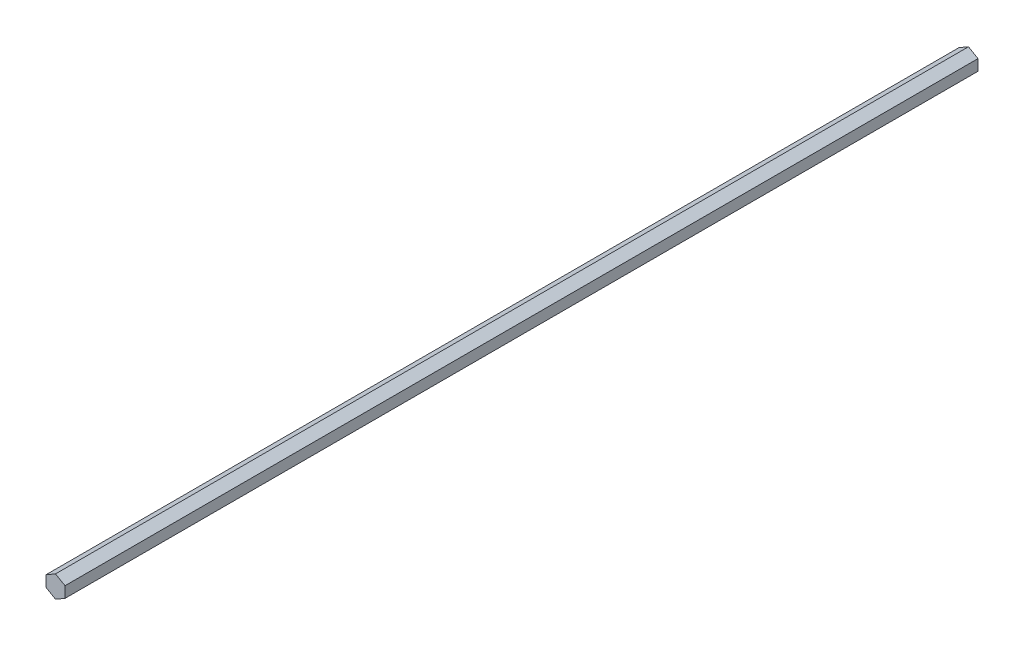
ISO-10303-21;
HEADER;
FILE_DESCRIPTION(('STEP AP214'),'2;1');
FILE_NAME('part.step','',(''),(''),'','','');
FILE_SCHEMA(('AUTOMOTIVE_DESIGN { 1 0 10303 214 1 1 1 1 }'));
ENDSEC;
DATA;
#1=APPLICATION_CONTEXT('core data for automotive mechanical design processes');
#2=APPLICATION_PROTOCOL_DEFINITION('international standard','automotive_design',2000,#1);
#3=PRODUCT_CONTEXT('',#1,'mechanical');
#4=PRODUCT('Part','Part','',(#3));
#5=PRODUCT_RELATED_PRODUCT_CATEGORY('part','',(#4));
#6=PRODUCT_DEFINITION_FORMATION('','',#4);
#7=PRODUCT_DEFINITION_CONTEXT('part definition',#1,'design');
#8=PRODUCT_DEFINITION('design','',#6,#7);
#9=PRODUCT_DEFINITION_SHAPE('','',#8);
#10=(LENGTH_UNIT() NAMED_UNIT(*) SI_UNIT(.MILLI.,.METRE.));
#11=(NAMED_UNIT(*) PLANE_ANGLE_UNIT() SI_UNIT($,.RADIAN.));
#12=(NAMED_UNIT(*) SI_UNIT($,.STERADIAN.) SOLID_ANGLE_UNIT());
#13=UNCERTAINTY_MEASURE_WITH_UNIT(LENGTH_MEASURE(1.E-05),#10,'distance_accuracy_value','');
#14=(GEOMETRIC_REPRESENTATION_CONTEXT(3) GLOBAL_UNCERTAINTY_ASSIGNED_CONTEXT((#13)) GLOBAL_UNIT_ASSIGNED_CONTEXT((#10,
#11,#12)) REPRESENTATION_CONTEXT('',''));
#15=CARTESIAN_POINT('',(0.,0.,0.));
#16=DIRECTION('',(0.,0.,1.));
#17=DIRECTION('',(1.,0.,0.));
#18=AXIS2_PLACEMENT_3D('',#15,#16,#17);
#19=CARTESIAN_POINT('',(-6.35,3.66617420935412,304.8));
#20=DIRECTION('',(0.5,-0.866025403784439,0.));
#21=DIRECTION('',(0.866025403784439,0.5,0.));
#22=AXIS2_PLACEMENT_3D('',#19,#20,#21);
#23=PLANE('',#22);
#24=DIRECTION('',(-0.866025403784439,-0.5,0.));
#25=VECTOR('',#24,1.);
#26=CARTESIAN_POINT('',(-6.35,3.66617420935412,-304.8));
#27=LINE('',#26,#25);
#28=CARTESIAN_POINT('',(0.,7.33234841870825,-304.8));
#29=VERTEX_POINT('',#28);
#30=CARTESIAN_POINT('',(-6.35,3.66617420935412,-304.8));
#31=VERTEX_POINT('',#30);
#32=EDGE_CURVE('E130',#29,#31,#27,.T.);
#33=ORIENTED_EDGE('',*,*,#32,.T.);
#34=DIRECTION('',(0.,0.,-1.));
#35=VECTOR('',#34,1.);
#36=CARTESIAN_POINT('',(-6.35,3.66617420935412,304.8));
#37=LINE('',#36,#35);
#38=CARTESIAN_POINT('',(-6.35,3.66617420935412,304.8));
#39=VERTEX_POINT('',#38);
#40=EDGE_CURVE('E11',#39,#31,#37,.T.);
#41=ORIENTED_EDGE('',*,*,#40,.F.);
#42=DIRECTION('',(-0.866025403784439,-0.5,0.));
#43=VECTOR('',#42,1.);
#44=CARTESIAN_POINT('',(-6.35,3.66617420935412,304.8));
#45=LINE('',#44,#43);
#46=CARTESIAN_POINT('',(0.,7.33234841870825,304.8));
#47=VERTEX_POINT('',#46);
#48=EDGE_CURVE('E146',#47,#39,#45,.T.);
#49=ORIENTED_EDGE('',*,*,#48,.F.);
#50=DIRECTION('',(0.,0.,-1.));
#51=VECTOR('',#50,1.);
#52=CARTESIAN_POINT('',(0.,7.33234841870825,304.8));
#53=LINE('',#52,#51);
#54=EDGE_CURVE('E126',#47,#29,#53,.T.);
#55=ORIENTED_EDGE('',*,*,#54,.T.);
#56=EDGE_LOOP('',(#33,#41,#49,#55));
#57=FACE_BOUND('',#56,.T.);
#58=ADVANCED_FACE('F41',(#57),#23,.F.);
#59=CARTESIAN_POINT('',(-6.35,-3.66617420935412,304.8));
#60=DIRECTION('',(1.,0.,0.));
#61=DIRECTION('',(0.,1.,0.));
#62=AXIS2_PLACEMENT_3D('',#59,#60,#61);
#63=PLANE('',#62);
#64=DIRECTION('',(0.,-1.,0.));
#65=VECTOR('',#64,1.);
#66=CARTESIAN_POINT('',(-6.35,-3.66617420935412,-304.8));
#67=LINE('',#66,#65);
#68=CARTESIAN_POINT('',(-6.35,-3.66617420935412,-304.8));
#69=VERTEX_POINT('',#68);
#70=EDGE_CURVE('E134',#31,#69,#67,.T.);
#71=ORIENTED_EDGE('',*,*,#70,.T.);
#72=DIRECTION('',(0.,0.,-1.));
#73=VECTOR('',#72,1.);
#74=CARTESIAN_POINT('',(-6.35,-3.66617420935412,304.8));
#75=LINE('',#74,#73);
#76=CARTESIAN_POINT('',(-6.35,-3.66617420935412,304.8));
#77=VERTEX_POINT('',#76);
#78=EDGE_CURVE('E50',#77,#69,#75,.T.);
#79=ORIENTED_EDGE('',*,*,#78,.F.);
#80=DIRECTION('',(0.,-1.,0.));
#81=VECTOR('',#80,1.);
#82=CARTESIAN_POINT('',(-6.35,-3.66617420935412,304.8));
#83=LINE('',#82,#81);
#84=EDGE_CURVE('E95',#39,#77,#83,.T.);
#85=ORIENTED_EDGE('',*,*,#84,.F.);
#86=ORIENTED_EDGE('',*,*,#40,.T.);
#87=EDGE_LOOP('',(#71,#79,#85,#86));
#88=FACE_BOUND('',#87,.T.);
#89=ADVANCED_FACE('F174',(#88),#63,.F.);
#90=CARTESIAN_POINT('',(0.,-7.33234841870825,304.8));
#91=DIRECTION('',(0.5,0.866025403784438,0.));
#92=DIRECTION('',(-0.866025403784438,0.5,0.));
#93=AXIS2_PLACEMENT_3D('',#90,#91,#92);
#94=PLANE('',#93);
#95=DIRECTION('',(0.866025403784438,-0.5,0.));
#96=VECTOR('',#95,1.);
#97=CARTESIAN_POINT('',(0.,-7.33234841870825,-304.8));
#98=LINE('',#97,#96);
#99=CARTESIAN_POINT('',(0.,-7.33234841870825,-304.8));
#100=VERTEX_POINT('',#99);
#101=EDGE_CURVE('E137',#69,#100,#98,.T.);
#102=ORIENTED_EDGE('',*,*,#101,.T.);
#103=DIRECTION('',(0.,0.,-1.));
#104=VECTOR('',#103,1.);
#105=CARTESIAN_POINT('',(0.,-7.33234841870825,304.8));
#106=LINE('',#105,#104);
#107=CARTESIAN_POINT('',(0.,-7.33234841870825,304.8));
#108=VERTEX_POINT('',#107);
#109=EDGE_CURVE('E119',#108,#100,#106,.T.);
#110=ORIENTED_EDGE('',*,*,#109,.F.);
#111=DIRECTION('',(0.866025403784438,-0.5,0.));
#112=VECTOR('',#111,1.);
#113=CARTESIAN_POINT('',(0.,-7.33234841870825,304.8));
#114=LINE('',#113,#112);
#115=EDGE_CURVE('E108',#77,#108,#114,.T.);
#116=ORIENTED_EDGE('',*,*,#115,.F.);
#117=ORIENTED_EDGE('',*,*,#78,.T.);
#118=EDGE_LOOP('',(#102,#110,#116,#117));
#119=FACE_BOUND('',#118,.T.);
#120=ADVANCED_FACE('F156',(#119),#94,.F.);
#121=CARTESIAN_POINT('',(6.35,-3.66617420935412,304.8));
#122=DIRECTION('',(-0.5,0.866025403784439,0.));
#123=DIRECTION('',(-0.866025403784439,-0.5,0.));
#124=AXIS2_PLACEMENT_3D('',#121,#122,#123);
#125=PLANE('',#124);
#126=DIRECTION('',(0.866025403784439,0.5,0.));
#127=VECTOR('',#126,1.);
#128=CARTESIAN_POINT('',(6.35,-3.66617420935412,-304.8));
#129=LINE('',#128,#127);
#130=CARTESIAN_POINT('',(6.35,-3.66617420935412,-304.8));
#131=VERTEX_POINT('',#130);
#132=EDGE_CURVE('E117',#100,#131,#129,.T.);
#133=ORIENTED_EDGE('',*,*,#132,.T.);
#134=DIRECTION('',(0.,0.,-1.));
#135=VECTOR('',#134,1.);
#136=CARTESIAN_POINT('',(6.35,-3.66617420935412,304.8));
#137=LINE('',#136,#135);
#138=CARTESIAN_POINT('',(6.35,-3.66617420935412,304.8));
#139=VERTEX_POINT('',#138);
#140=EDGE_CURVE('E114',#139,#131,#137,.T.);
#141=ORIENTED_EDGE('',*,*,#140,.F.);
#142=DIRECTION('',(0.866025403784439,0.5,0.));
#143=VECTOR('',#142,1.);
#144=CARTESIAN_POINT('',(6.35,-3.66617420935412,304.8));
#145=LINE('',#144,#143);
#146=EDGE_CURVE('E102',#108,#139,#145,.T.);
#147=ORIENTED_EDGE('',*,*,#146,.F.);
#148=ORIENTED_EDGE('',*,*,#109,.T.);
#149=EDGE_LOOP('',(#133,#141,#147,#148));
#150=FACE_BOUND('',#149,.T.);
#151=ADVANCED_FACE('F115',(#150),#125,.F.);
#152=CARTESIAN_POINT('',(6.35,3.66617420935412,304.8));
#153=DIRECTION('',(-1.,0.,0.));
#154=DIRECTION('',(0.,-1.,0.));
#155=AXIS2_PLACEMENT_3D('',#152,#153,#154);
#156=PLANE('',#155);
#157=DIRECTION('',(0.,1.,0.));
#158=VECTOR('',#157,1.);
#159=CARTESIAN_POINT('',(6.35,3.66617420935412,-304.8));
#160=LINE('',#159,#158);
#161=CARTESIAN_POINT('',(6.35,3.66617420935412,-304.8));
#162=VERTEX_POINT('',#161);
#163=EDGE_CURVE('E81',#131,#162,#160,.T.);
#164=ORIENTED_EDGE('',*,*,#163,.T.);
#165=DIRECTION('',(0.,0.,-1.));
#166=VECTOR('',#165,1.);
#167=CARTESIAN_POINT('',(6.35,3.66617420935412,304.8));
#168=LINE('',#167,#166);
#169=CARTESIAN_POINT('',(6.35,3.66617420935412,304.8));
#170=VERTEX_POINT('',#169);
#171=EDGE_CURVE('E120',#170,#162,#168,.T.);
#172=ORIENTED_EDGE('',*,*,#171,.F.);
#173=DIRECTION('',(0.,1.,0.));
#174=VECTOR('',#173,1.);
#175=CARTESIAN_POINT('',(6.35,3.66617420935412,304.8));
#176=LINE('',#175,#174);
#177=EDGE_CURVE('E106',#139,#170,#176,.T.);
#178=ORIENTED_EDGE('',*,*,#177,.F.);
#179=ORIENTED_EDGE('',*,*,#140,.T.);
#180=EDGE_LOOP('',(#164,#172,#178,#179));
#181=FACE_BOUND('',#180,.T.);
#182=ADVANCED_FACE('F122',(#181),#156,.F.);
#183=CARTESIAN_POINT('',(0.,7.33234841870825,304.8));
#184=DIRECTION('',(-0.5,-0.866025403784439,0.));
#185=DIRECTION('',(0.866025403784439,-0.5,0.));
#186=AXIS2_PLACEMENT_3D('',#183,#184,#185);
#187=PLANE('',#186);
#188=DIRECTION('',(-0.866025403784439,0.5,0.));
#189=VECTOR('',#188,1.);
#190=CARTESIAN_POINT('',(0.,7.33234841870825,-304.8));
#191=LINE('',#190,#189);
#192=EDGE_CURVE('E87',#162,#29,#191,.T.);
#193=ORIENTED_EDGE('',*,*,#192,.T.);
#194=ORIENTED_EDGE('',*,*,#54,.F.);
#195=DIRECTION('',(-0.866025403784439,0.5,0.));
#196=VECTOR('',#195,1.);
#197=CARTESIAN_POINT('',(0.,7.33234841870825,304.8));
#198=LINE('',#197,#196);
#199=EDGE_CURVE('E58',#170,#47,#198,.T.);
#200=ORIENTED_EDGE('',*,*,#199,.F.);
#201=ORIENTED_EDGE('',*,*,#171,.T.);
#202=EDGE_LOOP('',(#193,#194,#200,#201));
#203=FACE_BOUND('',#202,.T.);
#204=ADVANCED_FACE('F163',(#203),#187,.F.);
#205=CARTESIAN_POINT('',(0.,0.,304.8));
#206=DIRECTION('',(0.,0.,-1.));
#207=DIRECTION('',(-1.,0.,0.));
#208=AXIS2_PLACEMENT_3D('',#205,#206,#207);
#209=PLANE('',#208);
#210=ORIENTED_EDGE('',*,*,#48,.T.);
#211=ORIENTED_EDGE('',*,*,#84,.T.);
#212=ORIENTED_EDGE('',*,*,#115,.T.);
#213=ORIENTED_EDGE('',*,*,#146,.T.);
#214=ORIENTED_EDGE('',*,*,#177,.T.);
#215=ORIENTED_EDGE('',*,*,#199,.T.);
#216=EDGE_LOOP('',(#210,#211,#212,#213,#214,#215));
#217=FACE_BOUND('',#216,.T.);
#218=ADVANCED_FACE('F104',(#217),#209,.F.);
#219=CARTESIAN_POINT('',(0.,0.,-304.8));
#220=DIRECTION('',(0.,0.,-1.));
#221=DIRECTION('',(-1.,0.,0.));
#222=AXIS2_PLACEMENT_3D('',#219,#220,#221);
#223=PLANE('',#222);
#224=ORIENTED_EDGE('',*,*,#32,.F.);
#225=ORIENTED_EDGE('',*,*,#192,.F.);
#226=ORIENTED_EDGE('',*,*,#163,.F.);
#227=ORIENTED_EDGE('',*,*,#132,.F.);
#228=ORIENTED_EDGE('',*,*,#101,.F.);
#229=ORIENTED_EDGE('',*,*,#70,.F.);
#230=EDGE_LOOP('',(#224,#225,#226,#227,#228,#229));
#231=FACE_BOUND('',#230,.T.);
#232=ADVANCED_FACE('F159',(#231),#223,.T.);
#233=CLOSED_SHELL('',(#58,#89,#120,#151,#182,#204,#218,#232));
#234=MANIFOLD_SOLID_BREP('B2',#233);
#235=ADVANCED_BREP_SHAPE_REPRESENTATION('',(#18,#234),#14);
#236=SHAPE_DEFINITION_REPRESENTATION(#9,#235);
ENDSEC;
END-ISO-10303-21;
